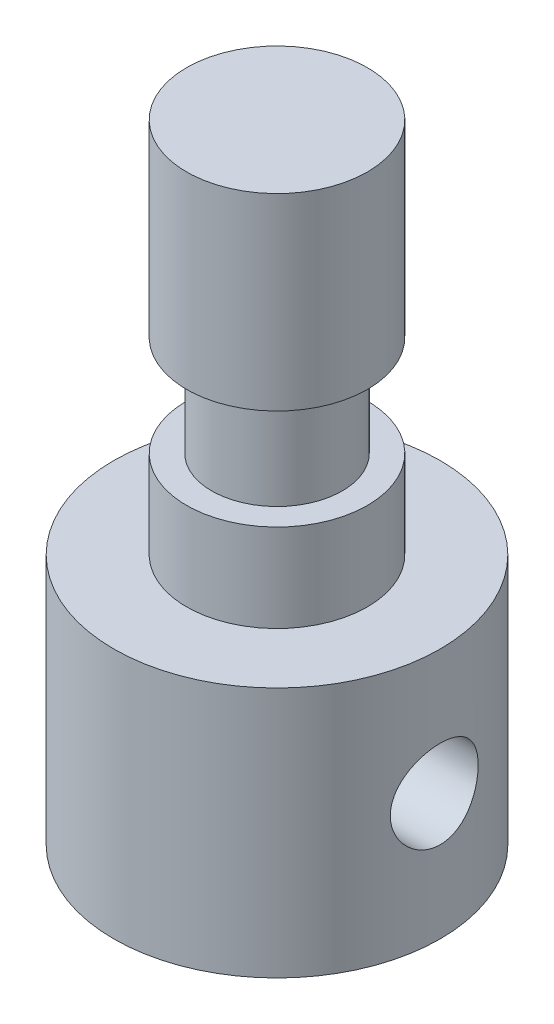
ISO-10303-21;
HEADER;
FILE_DESCRIPTION(('STEP AP214'),'2;1');
FILE_NAME('part.step','',(''),(''),'','','');
FILE_SCHEMA(('AUTOMOTIVE_DESIGN { 1 0 10303 214 1 1 1 1 }'));
ENDSEC;
DATA;
#1=APPLICATION_CONTEXT('core data for automotive mechanical design processes');
#2=APPLICATION_PROTOCOL_DEFINITION('international standard','automotive_design',2000,#1);
#3=PRODUCT_CONTEXT('',#1,'mechanical');
#4=PRODUCT('Part','Part','',(#3));
#5=PRODUCT_RELATED_PRODUCT_CATEGORY('part','',(#4));
#6=PRODUCT_DEFINITION_FORMATION('','',#4);
#7=PRODUCT_DEFINITION_CONTEXT('part definition',#1,'design');
#8=PRODUCT_DEFINITION('design','',#6,#7);
#9=PRODUCT_DEFINITION_SHAPE('','',#8);
#10=(LENGTH_UNIT() NAMED_UNIT(*) SI_UNIT(.MILLI.,.METRE.));
#11=(NAMED_UNIT(*) PLANE_ANGLE_UNIT() SI_UNIT($,.RADIAN.));
#12=(NAMED_UNIT(*) SI_UNIT($,.STERADIAN.) SOLID_ANGLE_UNIT());
#13=UNCERTAINTY_MEASURE_WITH_UNIT(LENGTH_MEASURE(1.E-05),#10,'distance_accuracy_value','');
#14=(GEOMETRIC_REPRESENTATION_CONTEXT(3) GLOBAL_UNCERTAINTY_ASSIGNED_CONTEXT((#13)) GLOBAL_UNIT_ASSIGNED_CONTEXT((#10,
#11,#12)) REPRESENTATION_CONTEXT('',''));
#15=CARTESIAN_POINT('',(0.,0.,0.));
#16=DIRECTION('',(0.,0.,1.));
#17=DIRECTION('',(1.,0.,0.));
#18=AXIS2_PLACEMENT_3D('',#15,#16,#17);
#19=CARTESIAN_POINT('',(0.,0.,0.));
#20=DIRECTION('',(0.,-1.,0.));
#21=DIRECTION('',(1.,0.,0.));
#22=AXIS2_PLACEMENT_3D('',#19,#20,#21);
#23=PLANE('',#22);
#24=CARTESIAN_POINT('',(0.,0.,0.));
#25=DIRECTION('',(0.,1.,0.));
#26=DIRECTION('',(-1.,0.,0.));
#27=AXIS2_PLACEMENT_3D('',#24,#25,#26);
#28=CIRCLE('',#27,6.5);
#29=CARTESIAN_POINT('',(-6.5,0.,0.));
#30=VERTEX_POINT('',#29);
#31=EDGE_CURVE('E53',#30,#30,#28,.T.);
#32=ORIENTED_EDGE('',*,*,#31,.F.);
#33=EDGE_LOOP('',(#32));
#34=FACE_BOUND('',#33,.T.);
#35=ADVANCED_FACE('F39',(#34),#23,.T.);
#36=CARTESIAN_POINT('',(0.,25.,0.));
#37=DIRECTION('',(0.,1.,0.));
#38=DIRECTION('',(-1.,0.,0.));
#39=AXIS2_PLACEMENT_3D('',#36,#37,#38);
#40=CYLINDRICAL_SURFACE('',#39,6.5);
#41=CARTESIAN_POINT('',(-6.5,3.25,0.));
#42=CARTESIAN_POINT('',(-6.49999858077069,3.25000221719261,0.0964383845188519));
#43=CARTESIAN_POINT('',(-6.49783268460272,3.25799844609694,0.192900388073903));
#44=CARTESIAN_POINT('',(-6.48940292607352,3.28971408038248,0.383043365803789));
#45=CARTESIAN_POINT('',(-6.48313714712617,3.31344083943663,0.476723017881562));
#46=CARTESIAN_POINT('',(-6.46719883607986,3.37578854141843,0.658529342407864));
#47=CARTESIAN_POINT('',(-6.45753074507855,3.41439007425274,0.746663078093723));
#48=CARTESIAN_POINT('',(-6.43580830743469,3.50531904310721,0.915205773197209));
#49=CARTESIAN_POINT('',(-6.42375378961486,3.55764746383814,0.995614177865597));
#50=CARTESIAN_POINT('',(-6.3982407904353,3.67584821482219,1.14832097293326));
#51=CARTESIAN_POINT('',(-6.38475794940813,3.74198432775404,1.22041111904501));
#52=CARTESIAN_POINT('',(-6.3580634824803,3.88535934625917,1.35262249115261));
#53=CARTESIAN_POINT('',(-6.34485189241872,3.96259970833152,1.41274214455667));
#54=CARTESIAN_POINT('',(-6.31994601039438,4.12766013169671,1.52032712747293));
#55=CARTESIAN_POINT('',(-6.3082824201253,4.21564209201324,1.56755182746172));
#56=CARTESIAN_POINT('',(-6.28815172848445,4.3986619635935,1.64645606790891));
#57=CARTESIAN_POINT('',(-6.2796840251003,4.49369854193154,1.67813853641029));
#58=CARTESIAN_POINT('',(-6.26715552446657,4.68582114787769,1.72433370646023));
#59=CARTESIAN_POINT('',(-6.2629978742277,4.78280980605261,1.73922444922668));
#60=CARTESIAN_POINT('',(-6.25927094241735,4.97799086426473,1.75259222438559));
#61=CARTESIAN_POINT('',(-6.25970078554045,5.07618303109821,1.75107238795779));
#62=CARTESIAN_POINT('',(-6.26501364939757,5.26802432851474,1.73196203849514));
#63=CARTESIAN_POINT('',(-6.26976958910593,5.3617232221105,1.71483011145095));
#64=CARTESIAN_POINT('',(-6.28299513741087,5.54486503121686,1.66571684714794));
#65=CARTESIAN_POINT('',(-6.2914650479176,5.63430760007377,1.63373430266414));
#66=CARTESIAN_POINT('',(-6.31127516962315,5.80758774780767,1.55545666361949));
#67=CARTESIAN_POINT('',(-6.3226471731219,5.89134931533733,1.50900169163076));
#68=CARTESIAN_POINT('',(-6.34696318619014,6.05004880429497,1.40320938289831));
#69=CARTESIAN_POINT('',(-6.35990751035925,6.12498495395174,1.34386946617843));
#70=CARTESIAN_POINT('',(-6.38643765734519,6.26652520523311,1.21165182609542));
#71=CARTESIAN_POINT('',(-6.40003049347118,6.33276907032923,1.13838932308233));
#72=CARTESIAN_POINT('',(-6.42594017101052,6.45210498169238,0.98162872268649));
#73=CARTESIAN_POINT('',(-6.43825696018162,6.50519648961656,0.89813020653963));
#74=CARTESIAN_POINT('',(-6.46030497893973,6.59688349066958,0.722702902314136));
#75=CARTESIAN_POINT('',(-6.47002433273058,6.63541272459217,0.630737893454155));
#76=CARTESIAN_POINT('',(-6.48569657964708,6.69635922946786,0.441314180126085));
#77=CARTESIAN_POINT('',(-6.49165031220561,6.71878009145339,0.343856705318809));
#78=CARTESIAN_POINT('',(-6.49899311627936,6.74630531054512,0.149287967502641));
#79=CARTESIAN_POINT('',(-6.50051122307747,6.75189931886128,0.052250739193374));
#80=CARTESIAN_POINT('',(-6.49918326317947,6.74696574510972,-0.141375733118523));
#81=CARTESIAN_POINT('',(-6.49633765694801,6.73643986403369,-0.237965023309447));
#82=CARTESIAN_POINT('',(-6.48668544438584,6.69996656502169,-0.42619882775705));
#83=CARTESIAN_POINT('',(-6.47994927429831,6.67429320907594,-0.517900390010936));
#84=CARTESIAN_POINT('',(-6.46328097858548,6.60857282182974,-0.695685463462234));
#85=CARTESIAN_POINT('',(-6.45334850327194,6.56852421776582,-0.78176835871557));
#86=CARTESIAN_POINT('',(-6.43108814161772,6.47428833376004,-0.947767802029043));
#87=CARTESIAN_POINT('',(-6.41871658060232,6.41983593416573,-1.02752784082325));
#88=CARTESIAN_POINT('',(-6.39300765310752,6.29867061113964,-1.17694991242572));
#89=CARTESIAN_POINT('',(-6.37967009237027,6.23195521750797,-1.24660990566205));
#90=CARTESIAN_POINT('',(-6.35305606912347,6.08587114701199,-1.37592483654475));
#91=CARTESIAN_POINT('',(-6.33979241811591,6.00619350712984,-1.43523403293632));
#92=CARTESIAN_POINT('',(-6.31524898835375,5.83773517809146,-1.53964865449488));
#93=CARTESIAN_POINT('',(-6.30396912817259,5.74895486279998,-1.58475466270515));
#94=CARTESIAN_POINT('',(-6.28480064726651,5.56524637340321,-1.65914352879327));
#95=CARTESIAN_POINT('',(-6.27689260413137,5.47035713572113,-1.68851726619279));
#96=CARTESIAN_POINT('',(-6.26536192393188,5.27673630337583,-1.73081766859199));
#97=CARTESIAN_POINT('',(-6.26173816583469,5.17800572083214,-1.74374863609987));
#98=CARTESIAN_POINT('',(-6.25928126935112,4.98304809438588,-1.75254547356032));
#99=CARTESIAN_POINT('',(-6.2602919755006,4.88684774443309,-1.74896757383288));
#100=CARTESIAN_POINT('',(-6.2666237964553,4.69647645832785,-1.72614124173499));
#101=CARTESIAN_POINT('',(-6.27194479624422,4.6023054680926,-1.7068932275074));
#102=CARTESIAN_POINT('',(-6.28620380749049,4.41938134200081,-1.65359837934439));
#103=CARTESIAN_POINT('',(-6.29511244645101,4.33059078904914,-1.61967155899706));
#104=CARTESIAN_POINT('',(-6.31554316959918,4.15989436761452,-1.53807525461537));
#105=CARTESIAN_POINT('',(-6.32706567087568,4.07798960074477,-1.4904035770119));
#106=CARTESIAN_POINT('',(-6.35185689602158,3.92073999936272,-1.38099412439163));
#107=CARTESIAN_POINT('',(-6.36516758553448,3.84566512520512,-1.31887781025303));
#108=CARTESIAN_POINT('',(-6.39180345359531,3.70682387413179,-1.18305941970198));
#109=CARTESIAN_POINT('',(-6.40512863488741,3.64306026279953,-1.10935451818707));
#110=CARTESIAN_POINT('',(-6.43064166563152,3.52727526370525,-0.950500686253518));
#111=CARTESIAN_POINT('',(-6.44279815943238,3.47554209529941,-0.865136208324721));
#112=CARTESIAN_POINT('',(-6.46425897327365,3.38724197265832,-0.686597083834916));
#113=CARTESIAN_POINT('',(-6.4735650875332,3.35066547266534,-0.59342739763071));
#114=CARTESIAN_POINT('',(-6.48710112720969,3.29838093798637,-0.417195701691814));
#115=CARTESIAN_POINT('',(-6.49190262266323,3.28028071260865,-0.334879451110579));
#116=CARTESIAN_POINT('',(-6.498352516354,3.25608989374566,-0.168381339936281));
#117=CARTESIAN_POINT('',(-6.50000123911909,3.2499980641848,-0.0841996722607438));
#118=CARTESIAN_POINT('',(-6.5,3.25,0.));
#119=B_SPLINE_CURVE_WITH_KNOTS('',3,(#41,#42,#43,#44,#45,#46,#47,#48,#49,#50,#51,#52,#53,#54,
#55,#56,#57,#58,#59,#60,#61,#62,#63,#64,#65,#66,#67,#68,#69,#70,#71,#72,#73,#74,#75,#76,#77,#78,
#79,#80,#81,#82,#83,#84,#85,#86,#87,#88,#89,#90,#91,#92,#93,#94,#95,#96,#97,#98,#99,#100,#101,
#102,#103,#104,#105,#106,#107,#108,#109,#110,#111,#112,#113,#114,#115,#116,#117,#118),
.UNSPECIFIED.,.T.,.F.,(4,2,2,2,2,2,2,2,2,2,2,2,2,2,2,2,2,2,2,2,2,2,2,2,2,2,2,2,2,2,2,2,2,2,2,2,
2,2,4),(0.,0.289006335573645,0.578147870533284,0.866913375415959,1.15569960082183,
1.45061243661619,1.7455639902778,2.04569252574374,2.34576449744911,2.63893678842027,
2.93205314237057,3.21682770404029,3.50162541943878,3.7896880895128,4.0778084921807,
4.37551645612281,4.67323660362118,4.97229553813187,5.27128778285868,5.56149104488235,
5.85166368639025,6.13674063704052,6.42184878682807,6.71262194530667,7.00345374008023,
7.30265769073015,7.60184935740544,7.89929353562962,8.19665986690052,8.48408165680866,
8.77149577737716,9.05660314326084,9.34175603520535,9.63544979343366,9.92921526058422,
10.2294239517479,10.5294432813106,10.7817986486686,11.0341280386515),.UNSPECIFIED.);
#120=CARTESIAN_POINT('',(-6.5,3.25,0.));
#121=VERTEX_POINT('',#120);
#122=EDGE_CURVE('E10',#121,#121,#119,.T.);
#123=ORIENTED_EDGE('',*,*,#122,.F.);
#124=EDGE_LOOP('',(#123));
#125=FACE_BOUND('',#124,.T.);
#126=CARTESIAN_POINT('',(6.25999201277446,5.,-1.75));
#127=CARTESIAN_POINT('',(6.25999364834224,5.09636693152251,-1.74999774759582));
#128=CARTESIAN_POINT('',(6.26224156413629,5.19275754831568,-1.74201295319679));
#129=CARTESIAN_POINT('',(6.27096280675779,5.38275250326044,-1.71034684680835));
#130=CARTESIAN_POINT('',(6.27743820017108,5.47635545526069,-1.68665785779758));
#131=CARTESIAN_POINT('',(6.2938290415138,5.65799901010124,-1.62442051083003));
#132=CARTESIAN_POINT('',(6.30373958680569,5.7460473299389,-1.58589332124238));
#133=CARTESIAN_POINT('',(6.32587778448479,5.91444505060657,-1.4951397936086));
#134=CARTESIAN_POINT('',(6.3381056295633,5.99479381035502,-1.44291231619848));
#135=CARTESIAN_POINT('',(6.36384999967837,6.14756006850606,-1.32481683575956));
#136=CARTESIAN_POINT('',(6.3773897230645,6.21975220686104,-1.25866230723127));
#137=CARTESIAN_POINT('',(6.40403218819677,6.35216265841744,-1.11520667104591));
#138=CARTESIAN_POINT('',(6.41713488377714,6.41237970993447,-1.03790439035032));
#139=CARTESIAN_POINT('',(6.44168618098059,6.5200732158384,-0.872781950497458));
#140=CARTESIAN_POINT('',(6.45310422745752,6.56732520712722,-0.784810457726851));
#141=CARTESIAN_POINT('',(6.47273330056194,6.64628270229484,-0.601812853080342));
#142=CARTESIAN_POINT('',(6.48094487877107,6.67799088028443,-0.506787957891646));
#143=CARTESIAN_POINT('',(6.49307175079196,6.72423010837478,-0.314733668615917));
#144=CARTESIAN_POINT('',(6.49708279945289,6.73914461038798,-0.21780274733007));
#145=CARTESIAN_POINT('',(6.50069164682133,6.75257997140598,-0.0227371580313491));
#146=CARTESIAN_POINT('',(6.50029019790353,6.75110362521287,0.0753973019158801));
#147=CARTESIAN_POINT('',(6.49518926169102,6.73206830522229,0.26741377769112));
#148=CARTESIAN_POINT('',(6.49060051383683,6.71492368507153,0.361340261807484));
#149=CARTESIAN_POINT('',(6.47777153275455,6.66570843590665,0.544930372626495));
#150=CARTESIAN_POINT('',(6.46953108931706,6.63363694762386,0.63459375359507));
#151=CARTESIAN_POINT('',(6.45016118673602,6.55516353757223,0.808164857586513));
#152=CARTESIAN_POINT('',(6.4390034608576,6.50862051045036,0.8920055011465));
#153=CARTESIAN_POINT('',(6.41499985670216,6.40263373543751,1.05082715179685));
#154=CARTESIAN_POINT('',(6.40215364408583,6.34318743103043,1.12580639863236));
#155=CARTESIAN_POINT('',(6.3756898932816,6.21088557205601,1.26725020143797));
#156=CARTESIAN_POINT('',(6.36206079715831,6.13766877046342,1.33337509587472));
#157=CARTESIAN_POINT('',(6.3359290690376,5.98104466905633,1.4524916204695));
#158=CARTESIAN_POINT('',(6.32342650852571,5.8976367233418,1.5054824175621));
#159=CARTESIAN_POINT('',(6.30091637245831,5.72225009692862,1.59709184385151));
#160=CARTESIAN_POINT('',(6.2909252527284,5.63022004826683,1.63561645775796));
#161=CARTESIAN_POINT('',(6.27477285061401,5.44065286740862,1.69653467948176));
#162=CARTESIAN_POINT('',(6.26861059736745,5.3431171381018,1.71893237673102));
#163=CARTESIAN_POINT('',(6.26102094544429,5.14848803959217,1.74637186636212));
#164=CARTESIAN_POINT('',(6.25945517547943,5.05147152071337,1.75192104365597));
#165=CARTESIAN_POINT('',(6.26085688983675,4.85789646580634,1.74690530793352));
#166=CARTESIAN_POINT('',(6.26382388109206,4.7613378811108,1.73634214759296));
#167=CARTESIAN_POINT('',(6.27382299499932,4.57338610023024,1.69984924549857));
#168=CARTESIAN_POINT('',(6.2807739509207,4.48192864140859,1.67422606891518));
#169=CARTESIAN_POINT('',(6.2978781488742,4.30460992983484,1.60868595575755));
#170=CARTESIAN_POINT('',(6.30803181501428,4.21874942005764,1.56876712603544));
#171=CARTESIAN_POINT('',(6.3306802252249,4.05294338845818,1.47474379322779));
#172=CARTESIAN_POINT('',(6.34322221754839,3.97317294112376,1.42034219945109));
#173=CARTESIAN_POINT('',(6.36912368079378,3.82370694371339,1.29926471321737));
#174=CARTESIAN_POINT('',(6.38248330813777,3.75401333006983,1.23258646717786));
#175=CARTESIAN_POINT('',(6.40899229302136,3.62456493243245,1.08649869302637));
#176=CARTESIAN_POINT('',(6.42212379122641,3.56516441907997,1.00677135328087));
#177=CARTESIAN_POINT('',(6.4462926745243,3.46058906570298,0.838183298457967));
#178=CARTESIAN_POINT('',(6.45733017110619,3.41541346822946,0.749323070023383));
#179=CARTESIAN_POINT('',(6.47599626465671,3.34098780866232,0.565617208692502));
#180=CARTESIAN_POINT('',(6.48365032258865,3.31161842448716,0.470822629812634));
#181=CARTESIAN_POINT('',(6.49479925674954,3.26929493149581,0.277406294370142));
#182=CARTESIAN_POINT('',(6.49829507386145,3.25633710920122,0.17878540880094));
#183=CARTESIAN_POINT('',(6.50068826313714,3.24744093440552,-0.0161770838355526));
#184=CARTESIAN_POINT('',(6.49972592187705,3.25098338109258,-0.112493609735223));
#185=CARTESIAN_POINT('',(6.49362915521792,3.2737790501558,-0.30310696869598));
#186=CARTESIAN_POINT('',(6.48849489189772,3.2930316621934,-0.397403880072865));
#187=CARTESIAN_POINT('',(6.47465995714558,3.34640532578378,-0.580663944124792));
#188=CARTESIAN_POINT('',(6.46598501203548,3.38041923341873,-0.669660373083972));
#189=CARTESIAN_POINT('',(6.44597493719408,3.46225440917336,-0.840733705885814));
#190=CARTESIAN_POINT('',(6.43463942891539,3.51007764231986,-0.922809622810751));
#191=CARTESIAN_POINT('',(6.41013655471923,3.61968338617937,-1.08012193055955));
#192=CARTESIAN_POINT('',(6.39692789682886,3.68180882444473,-1.1551129380784));
#193=CARTESIAN_POINT('',(6.37033174209729,3.81760750704241,-1.29378095877782));
#194=CARTESIAN_POINT('',(6.35694419882193,3.89128380513143,-1.35745497050413));
#195=CARTESIAN_POINT('',(6.33115802415569,4.05009028339241,-1.47310400417226));
#196=CARTESIAN_POINT('',(6.31878848133984,4.13544118706903,-1.52478300921252));
#197=CARTESIAN_POINT('',(6.2968530124979,4.31394271271354,-1.61298526211571));
#198=CARTESIAN_POINT('',(6.2872852876391,4.40708828070918,-1.64951824037444));
#199=CARTESIAN_POINT('',(6.2733380131077,4.58321606222728,-1.70171523556074));
#200=CARTESIAN_POINT('',(6.26837422512567,4.66544849671204,-1.71977900317144));
#201=CARTESIAN_POINT('',(6.26170070500979,4.83178142103546,-1.74392165433437));
#202=CARTESIAN_POINT('',(6.25999058509381,4.91588168705138,-1.75000196611469));
#203=CARTESIAN_POINT('',(6.25999201277446,5.,-1.75));
#204=B_SPLINE_CURVE_WITH_KNOTS('',3,(#126,#127,#128,#129,#130,#131,#132,#133,#134,#135,#136,
#137,#138,#139,#140,#141,#142,#143,#144,#145,#146,#147,#148,#149,#150,#151,#152,#153,#154,#155,
#156,#157,#158,#159,#160,#161,#162,#163,#164,#165,#166,#167,#168,#169,#170,#171,#172,#173,#174,
#175,#176,#177,#178,#179,#180,#181,#182,#183,#184,#185,#186,#187,#188,#189,#190,#191,#192,#193,
#194,#195,#196,#197,#198,#199,#200,#201,#202,#203),.UNSPECIFIED.,.T.,.F.,(4,2,2,2,2,2,2,2,2,2,2,
2,2,2,2,2,2,2,2,2,2,2,2,2,2,2,2,2,2,2,2,2,2,2,2,2,2,2,4),(0.,0.288791410137463,
0.577724100637719,0.866246113798619,1.1547921290732,1.44998553324109,1.74521002226255,
2.04526257489719,2.34526348926331,2.63826599522772,2.93121854212772,3.21664121132964,
3.50208031298715,3.79039483129319,4.07876652535361,4.37615760001787,4.67356753268635,
4.97287817987484,5.27211290170058,5.56224219802969,5.85233993678286,6.13672745448546,
6.4211526470554,6.71193431253595,7.00277178252912,7.30219773917364,7.60160774927308,
7.89872460917345,8.19577422780333,8.48354110991476,8.77129681284008,9.0569979064276,
9.34273967450006,9.63621883592373,9.92977571709858,10.2299488059667,10.5299287520335,
10.7820436801477,11.0341285585496),.UNSPECIFIED.);
#205=CARTESIAN_POINT('',(6.25999201277446,5.,-1.75));
#206=VERTEX_POINT('',#205);
#207=EDGE_CURVE('E49',#206,#206,#204,.T.);
#208=ORIENTED_EDGE('',*,*,#207,.F.);
#209=EDGE_LOOP('',(#208));
#210=FACE_BOUND('',#209,.T.);
#211=ORIENTED_EDGE('',*,*,#31,.T.);
#212=EDGE_LOOP('',(#211));
#213=FACE_BOUND('',#212,.T.);
#214=CARTESIAN_POINT('',(0.,10.,0.));
#215=DIRECTION('',(0.,1.,0.));
#216=DIRECTION('',(-1.,0.,0.));
#217=AXIS2_PLACEMENT_3D('',#214,#215,#216);
#218=CIRCLE('',#217,6.5);
#219=CARTESIAN_POINT('',(-6.5,10.,0.));
#220=VERTEX_POINT('',#219);
#221=EDGE_CURVE('E57',#220,#220,#218,.T.);
#222=ORIENTED_EDGE('',*,*,#221,.F.);
#223=EDGE_LOOP('',(#222));
#224=FACE_BOUND('',#223,.T.);
#225=ADVANCED_FACE('F63',(#125,#210,#213,#224),#40,.T.);
#226=CARTESIAN_POINT('',(-6.5,10.,0.));
#227=DIRECTION('',(0.,1.,0.));
#228=DIRECTION('',(-1.,0.,0.));
#229=AXIS2_PLACEMENT_3D('',#226,#227,#228);
#230=PLANE('',#229);
#231=ORIENTED_EDGE('',*,*,#221,.T.);
#232=EDGE_LOOP('',(#231));
#233=FACE_BOUND('',#232,.T.);
#234=CARTESIAN_POINT('',(0.,10.,0.));
#235=DIRECTION('',(0.,1.,0.));
#236=DIRECTION('',(-1.,0.,0.));
#237=AXIS2_PLACEMENT_3D('',#234,#235,#236);
#238=CIRCLE('',#237,3.6);
#239=CARTESIAN_POINT('',(-3.6,10.,0.));
#240=VERTEX_POINT('',#239);
#241=EDGE_CURVE('E111',#240,#240,#238,.T.);
#242=ORIENTED_EDGE('',*,*,#241,.F.);
#243=EDGE_LOOP('',(#242));
#244=FACE_BOUND('',#243,.T.);
#245=ADVANCED_FACE('F93',(#233,#244),#230,.T.);
#246=CARTESIAN_POINT('',(0.,25.,0.));
#247=DIRECTION('',(0.,1.,0.));
#248=DIRECTION('',(-1.,0.,0.));
#249=AXIS2_PLACEMENT_3D('',#246,#247,#248);
#250=CYLINDRICAL_SURFACE('',#249,3.6);
#251=ORIENTED_EDGE('',*,*,#241,.T.);
#252=EDGE_LOOP('',(#251));
#253=FACE_BOUND('',#252,.T.);
#254=CARTESIAN_POINT('',(0.,13.5,0.));
#255=DIRECTION('',(0.,1.,0.));
#256=DIRECTION('',(-1.,0.,0.));
#257=AXIS2_PLACEMENT_3D('',#254,#255,#256);
#258=CIRCLE('',#257,3.6);
#259=CARTESIAN_POINT('',(-3.6,13.5,0.));
#260=VERTEX_POINT('',#259);
#261=EDGE_CURVE('E113',#260,#260,#258,.T.);
#262=ORIENTED_EDGE('',*,*,#261,.F.);
#263=EDGE_LOOP('',(#262));
#264=FACE_BOUND('',#263,.T.);
#265=ADVANCED_FACE('F90',(#253,#264),#250,.T.);
#266=CARTESIAN_POINT('',(-3.6,13.5,0.));
#267=DIRECTION('',(0.,1.,0.));
#268=DIRECTION('',(-1.,0.,0.));
#269=AXIS2_PLACEMENT_3D('',#266,#267,#268);
#270=PLANE('',#269);
#271=ORIENTED_EDGE('',*,*,#261,.T.);
#272=EDGE_LOOP('',(#271));
#273=FACE_BOUND('',#272,.T.);
#274=CARTESIAN_POINT('',(0.,13.5,0.));
#275=DIRECTION('',(0.,1.,0.));
#276=DIRECTION('',(-1.,0.,0.));
#277=AXIS2_PLACEMENT_3D('',#274,#275,#276);
#278=CIRCLE('',#277,2.6);
#279=CARTESIAN_POINT('',(-2.6,13.5,0.));
#280=VERTEX_POINT('',#279);
#281=EDGE_CURVE('E118',#280,#280,#278,.T.);
#282=ORIENTED_EDGE('',*,*,#281,.F.);
#283=EDGE_LOOP('',(#282));
#284=FACE_BOUND('',#283,.T.);
#285=ADVANCED_FACE('F86',(#273,#284),#270,.T.);
#286=CARTESIAN_POINT('',(0.,25.,0.));
#287=DIRECTION('',(0.,1.,0.));
#288=DIRECTION('',(-1.,0.,0.));
#289=AXIS2_PLACEMENT_3D('',#286,#287,#288);
#290=CYLINDRICAL_SURFACE('',#289,2.6);
#291=ORIENTED_EDGE('',*,*,#281,.T.);
#292=EDGE_LOOP('',(#291));
#293=FACE_BOUND('',#292,.T.);
#294=CARTESIAN_POINT('',(0.,17.5,0.));
#295=DIRECTION('',(0.,1.,0.));
#296=DIRECTION('',(-1.,0.,0.));
#297=AXIS2_PLACEMENT_3D('',#294,#295,#296);
#298=CIRCLE('',#297,2.6);
#299=CARTESIAN_POINT('',(-2.6,17.5,0.));
#300=VERTEX_POINT('',#299);
#301=EDGE_CURVE('E121',#300,#300,#298,.T.);
#302=ORIENTED_EDGE('',*,*,#301,.F.);
#303=EDGE_LOOP('',(#302));
#304=FACE_BOUND('',#303,.T.);
#305=ADVANCED_FACE('F82',(#293,#304),#290,.T.);
#306=CARTESIAN_POINT('',(-3.6,17.5,0.));
#307=DIRECTION('',(0.,-1.,0.));
#308=DIRECTION('',(1.,0.,0.));
#309=AXIS2_PLACEMENT_3D('',#306,#307,#308);
#310=PLANE('',#309);
#311=ORIENTED_EDGE('',*,*,#301,.T.);
#312=EDGE_LOOP('',(#311));
#313=FACE_BOUND('',#312,.T.);
#314=CARTESIAN_POINT('',(0.,17.5,0.));
#315=DIRECTION('',(0.,1.,0.));
#316=DIRECTION('',(-1.,0.,0.));
#317=AXIS2_PLACEMENT_3D('',#314,#315,#316);
#318=CIRCLE('',#317,3.6);
#319=CARTESIAN_POINT('',(-3.6,17.5,0.));
#320=VERTEX_POINT('',#319);
#321=EDGE_CURVE('E124',#320,#320,#318,.T.);
#322=ORIENTED_EDGE('',*,*,#321,.F.);
#323=EDGE_LOOP('',(#322));
#324=FACE_BOUND('',#323,.T.);
#325=ADVANCED_FACE('F78',(#313,#324),#310,.T.);
#326=CARTESIAN_POINT('',(0.,25.,0.));
#327=DIRECTION('',(0.,1.,0.));
#328=DIRECTION('',(-1.,0.,0.));
#329=AXIS2_PLACEMENT_3D('',#326,#327,#328);
#330=CYLINDRICAL_SURFACE('',#329,3.6);
#331=ORIENTED_EDGE('',*,*,#321,.T.);
#332=EDGE_LOOP('',(#331));
#333=FACE_BOUND('',#332,.T.);
#334=CARTESIAN_POINT('',(0.,25.,0.));
#335=DIRECTION('',(0.,1.,0.));
#336=DIRECTION('',(-1.,0.,0.));
#337=AXIS2_PLACEMENT_3D('',#334,#335,#336);
#338=CIRCLE('',#337,3.6);
#339=CARTESIAN_POINT('',(-3.6,25.,0.));
#340=VERTEX_POINT('',#339);
#341=EDGE_CURVE('E127',#340,#340,#338,.T.);
#342=ORIENTED_EDGE('',*,*,#341,.F.);
#343=EDGE_LOOP('',(#342));
#344=FACE_BOUND('',#343,.T.);
#345=ADVANCED_FACE('F74',(#333,#344),#330,.T.);
#346=CARTESIAN_POINT('',(-3.6,25.,0.));
#347=DIRECTION('',(0.,1.,0.));
#348=DIRECTION('',(-1.,0.,0.));
#349=AXIS2_PLACEMENT_3D('',#346,#347,#348);
#350=PLANE('',#349);
#351=ORIENTED_EDGE('',*,*,#341,.T.);
#352=EDGE_LOOP('',(#351));
#353=FACE_BOUND('',#352,.T.);
#354=ADVANCED_FACE('F70',(#353),#350,.T.);
#355=CARTESIAN_POINT('',(-6.5,5.,0.));
#356=DIRECTION('',(1.,0.,0.));
#357=DIRECTION('',(0.,0.,-1.));
#358=AXIS2_PLACEMENT_3D('',#355,#356,#357);
#359=CYLINDRICAL_SURFACE('',#358,1.75);
#360=ORIENTED_EDGE('',*,*,#122,.T.);
#361=EDGE_LOOP('',(#360));
#362=FACE_BOUND('',#361,.T.);
#363=ORIENTED_EDGE('',*,*,#207,.T.);
#364=EDGE_LOOP('',(#363));
#365=FACE_BOUND('',#364,.T.);
#366=ADVANCED_FACE('F66',(#362,#365),#359,.F.);
#367=CLOSED_SHELL('',(#35,#225,#245,#265,#285,#305,#325,#345,#354,#366));
#368=MANIFOLD_SOLID_BREP('B2',#367);
#369=ADVANCED_BREP_SHAPE_REPRESENTATION('',(#18,#368),#14);
#370=SHAPE_DEFINITION_REPRESENTATION(#9,#369);
ENDSEC;
END-ISO-10303-21;
